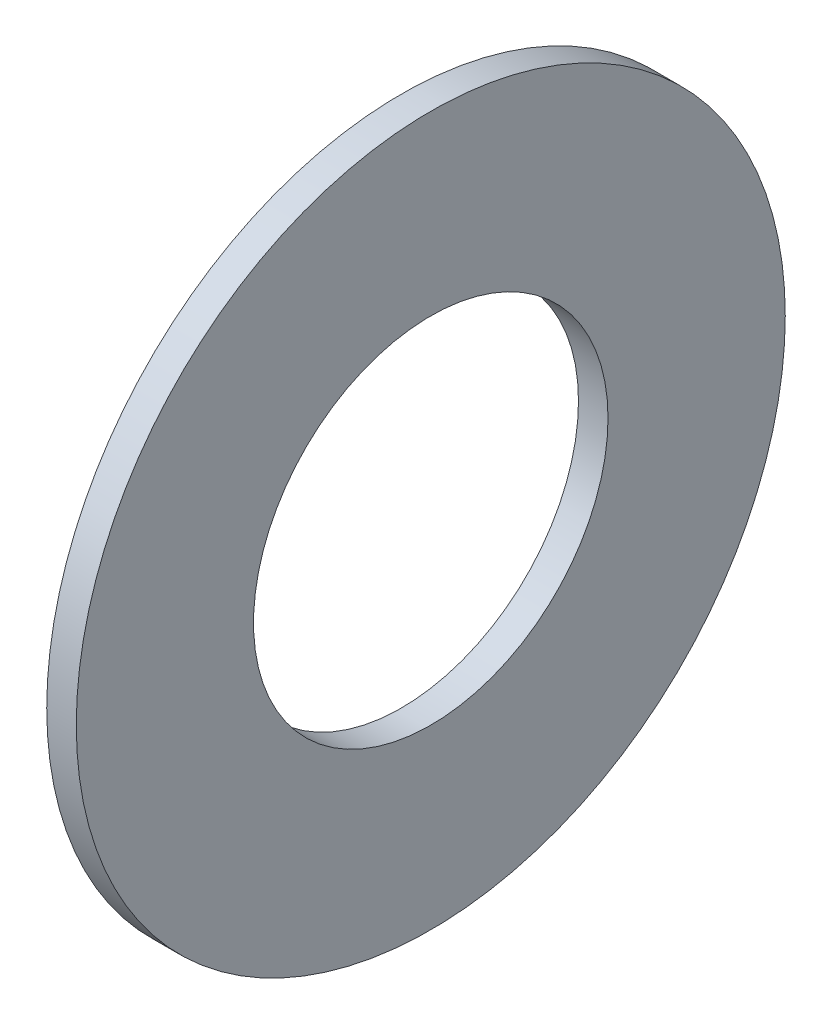
ISO-10303-21;
HEADER;
FILE_DESCRIPTION(('STEP AP214'),'2;1');
FILE_NAME('part.step','',(''),(''),'','','');
FILE_SCHEMA(('AUTOMOTIVE_DESIGN { 1 0 10303 214 1 1 1 1 }'));
ENDSEC;
DATA;
#1=APPLICATION_CONTEXT('core data for automotive mechanical design processes');
#2=APPLICATION_PROTOCOL_DEFINITION('international standard','automotive_design',2000,#1);
#3=PRODUCT_CONTEXT('',#1,'mechanical');
#4=PRODUCT('Part','Part','',(#3));
#5=PRODUCT_RELATED_PRODUCT_CATEGORY('part','',(#4));
#6=PRODUCT_DEFINITION_FORMATION('','',#4);
#7=PRODUCT_DEFINITION_CONTEXT('part definition',#1,'design');
#8=PRODUCT_DEFINITION('design','',#6,#7);
#9=PRODUCT_DEFINITION_SHAPE('','',#8);
#10=(LENGTH_UNIT() NAMED_UNIT(*) SI_UNIT(.MILLI.,.METRE.));
#11=(NAMED_UNIT(*) PLANE_ANGLE_UNIT() SI_UNIT($,.RADIAN.));
#12=(NAMED_UNIT(*) SI_UNIT($,.STERADIAN.) SOLID_ANGLE_UNIT());
#13=UNCERTAINTY_MEASURE_WITH_UNIT(LENGTH_MEASURE(1.E-05),#10,'distance_accuracy_value','');
#14=(GEOMETRIC_REPRESENTATION_CONTEXT(3) GLOBAL_UNCERTAINTY_ASSIGNED_CONTEXT((#13)) GLOBAL_UNIT_ASSIGNED_CONTEXT((#10,
#11,#12)) REPRESENTATION_CONTEXT('',''));
#15=CARTESIAN_POINT('',(0.,0.,0.));
#16=DIRECTION('',(0.,0.,1.));
#17=DIRECTION('',(1.,0.,0.));
#18=AXIS2_PLACEMENT_3D('',#15,#16,#17);
#19=CARTESIAN_POINT('',(0.5,0.,0.));
#20=DIRECTION('',(1.,0.,0.));
#21=DIRECTION('',(0.,0.,-1.));
#22=AXIS2_PLACEMENT_3D('',#19,#20,#21);
#23=PLANE('',#22);
#24=CARTESIAN_POINT('',(0.5,0.,0.));
#25=DIRECTION('',(1.,0.,0.));
#26=DIRECTION('',(0.,0.,-1.));
#27=AXIS2_PLACEMENT_3D('',#24,#25,#26);
#28=CIRCLE('',#27,6.);
#29=CARTESIAN_POINT('',(0.5,0.,-6.));
#30=VERTEX_POINT('',#29);
#31=EDGE_CURVE('E27',#30,#30,#28,.F.);
#32=ORIENTED_EDGE('',*,*,#31,.F.);
#33=EDGE_LOOP('',(#32));
#34=FACE_BOUND('',#33,.T.);
#35=CARTESIAN_POINT('',(0.5,0.,0.));
#36=DIRECTION('',(1.,0.,0.));
#37=DIRECTION('',(0.,0.,-1.));
#38=AXIS2_PLACEMENT_3D('',#35,#36,#37);
#39=CIRCLE('',#38,3.);
#40=CARTESIAN_POINT('',(0.5,0.,-3.));
#41=VERTEX_POINT('',#40);
#42=EDGE_CURVE('E18',#41,#41,#39,.F.);
#43=ORIENTED_EDGE('',*,*,#42,.T.);
#44=EDGE_LOOP('',(#43));
#45=FACE_BOUND('',#44,.T.);
#46=ADVANCED_FACE('F15',(#34,#45),#23,.T.);
#47=CARTESIAN_POINT('',(-0.025,0.,0.));
#48=DIRECTION('',(1.,0.,0.));
#49=DIRECTION('',(0.,0.,-1.));
#50=AXIS2_PLACEMENT_3D('',#47,#48,#49);
#51=CYLINDRICAL_SURFACE('',#50,3.);
#52=ORIENTED_EDGE('',*,*,#42,.F.);
#53=EDGE_LOOP('',(#52));
#54=FACE_BOUND('',#53,.T.);
#55=CARTESIAN_POINT('',(0.,0.,0.));
#56=DIRECTION('',(1.,0.,0.));
#57=DIRECTION('',(0.,0.,-1.));
#58=AXIS2_PLACEMENT_3D('',#55,#56,#57);
#59=CIRCLE('',#58,3.);
#60=CARTESIAN_POINT('',(0.,0.,-3.));
#61=VERTEX_POINT('',#60);
#62=EDGE_CURVE('E22',#61,#61,#59,.F.);
#63=ORIENTED_EDGE('',*,*,#62,.T.);
#64=EDGE_LOOP('',(#63));
#65=FACE_BOUND('',#64,.T.);
#66=ADVANCED_FACE('F36',(#54,#65),#51,.F.);
#67=CARTESIAN_POINT('',(-0.025,0.,0.));
#68=DIRECTION('',(1.,0.,0.));
#69=DIRECTION('',(0.,0.,-1.));
#70=AXIS2_PLACEMENT_3D('',#67,#68,#69);
#71=CYLINDRICAL_SURFACE('',#70,6.);
#72=ORIENTED_EDGE('',*,*,#31,.T.);
#73=EDGE_LOOP('',(#72));
#74=FACE_BOUND('',#73,.T.);
#75=CARTESIAN_POINT('',(0.,0.,0.));
#76=DIRECTION('',(1.,0.,0.));
#77=DIRECTION('',(0.,0.,-1.));
#78=AXIS2_PLACEMENT_3D('',#75,#76,#77);
#79=CIRCLE('',#78,6.);
#80=CARTESIAN_POINT('',(0.,0.,-6.));
#81=VERTEX_POINT('',#80);
#82=EDGE_CURVE('E10',#81,#81,#79,.T.);
#83=ORIENTED_EDGE('',*,*,#82,.T.);
#84=EDGE_LOOP('',(#83));
#85=FACE_BOUND('',#84,.T.);
#86=ADVANCED_FACE('F39',(#74,#85),#71,.T.);
#87=CARTESIAN_POINT('',(0.,0.,0.));
#88=DIRECTION('',(1.,0.,0.));
#89=DIRECTION('',(0.,0.,-1.));
#90=AXIS2_PLACEMENT_3D('',#87,#88,#89);
#91=PLANE('',#90);
#92=ORIENTED_EDGE('',*,*,#82,.F.);
#93=EDGE_LOOP('',(#92));
#94=FACE_BOUND('',#93,.T.);
#95=ORIENTED_EDGE('',*,*,#62,.F.);
#96=EDGE_LOOP('',(#95));
#97=FACE_BOUND('',#96,.T.);
#98=ADVANCED_FACE('F42',(#94,#97),#91,.F.);
#99=CLOSED_SHELL('',(#46,#66,#86,#98));
#100=MANIFOLD_SOLID_BREP('B1',#99);
#101=ADVANCED_BREP_SHAPE_REPRESENTATION('',(#18,#100),#14);
#102=SHAPE_DEFINITION_REPRESENTATION(#9,#101);
ENDSEC;
END-ISO-10303-21;
